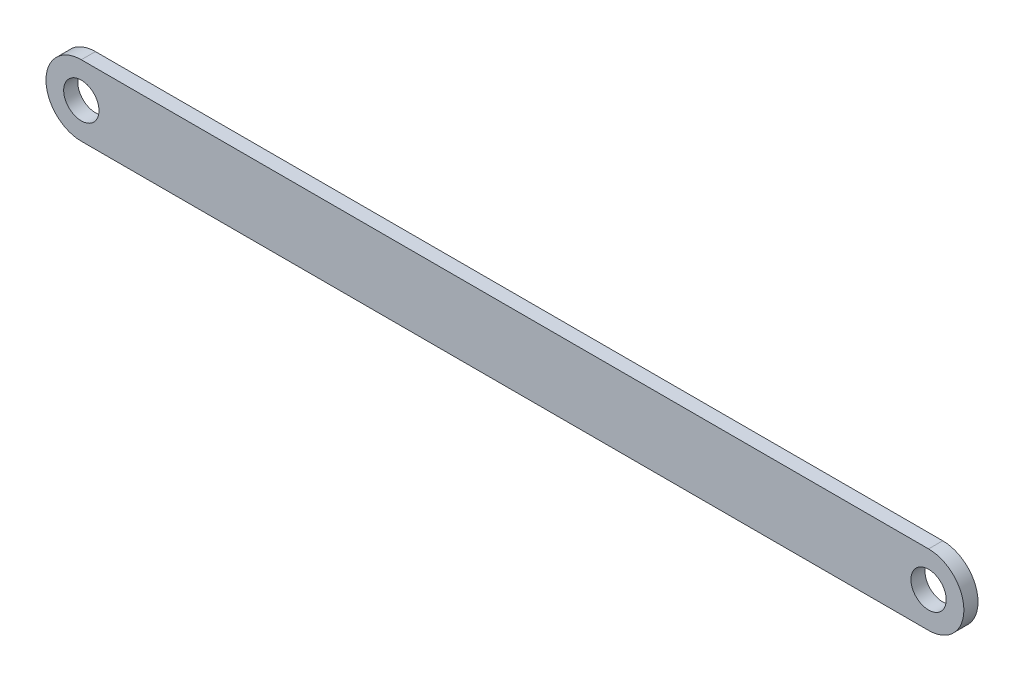
ISO-10303-21;
HEADER;
FILE_DESCRIPTION(('STEP AP214'),'2;1');
FILE_NAME('part.step','',(''),(''),'','','');
FILE_SCHEMA(('AUTOMOTIVE_DESIGN { 1 0 10303 214 1 1 1 1 }'));
ENDSEC;
DATA;
#1=APPLICATION_CONTEXT('core data for automotive mechanical design processes');
#2=APPLICATION_PROTOCOL_DEFINITION('international standard','automotive_design',2000,#1);
#3=PRODUCT_CONTEXT('',#1,'mechanical');
#4=PRODUCT('Part','Part','',(#3));
#5=PRODUCT_RELATED_PRODUCT_CATEGORY('part','',(#4));
#6=PRODUCT_DEFINITION_FORMATION('','',#4);
#7=PRODUCT_DEFINITION_CONTEXT('part definition',#1,'design');
#8=PRODUCT_DEFINITION('design','',#6,#7);
#9=PRODUCT_DEFINITION_SHAPE('','',#8);
#10=(LENGTH_UNIT() NAMED_UNIT(*) SI_UNIT(.MILLI.,.METRE.));
#11=(NAMED_UNIT(*) PLANE_ANGLE_UNIT() SI_UNIT($,.RADIAN.));
#12=(NAMED_UNIT(*) SI_UNIT($,.STERADIAN.) SOLID_ANGLE_UNIT());
#13=UNCERTAINTY_MEASURE_WITH_UNIT(LENGTH_MEASURE(1.E-05),#10,'distance_accuracy_value','');
#14=(GEOMETRIC_REPRESENTATION_CONTEXT(3) GLOBAL_UNCERTAINTY_ASSIGNED_CONTEXT((#13)) GLOBAL_UNIT_ASSIGNED_CONTEXT((#10,
#11,#12)) REPRESENTATION_CONTEXT('',''));
#15=CARTESIAN_POINT('',(0.,0.,0.));
#16=DIRECTION('',(0.,0.,1.));
#17=DIRECTION('',(1.,0.,0.));
#18=AXIS2_PLACEMENT_3D('',#15,#16,#17);
#19=CARTESIAN_POINT('',(-34.4915254237288,0.,2.));
#20=DIRECTION('',(0.,0.,1.));
#21=DIRECTION('',(1.,0.,0.));
#22=AXIS2_PLACEMENT_3D('',#19,#20,#21);
#23=PLANE('',#22);
#24=CARTESIAN_POINT('',(-34.4915254237288,0.,2.));
#25=DIRECTION('',(0.,0.,1.));
#26=DIRECTION('',(1.,0.,0.));
#27=AXIS2_PLACEMENT_3D('',#24,#25,#26);
#28=CIRCLE('',#27,2.5);
#29=CARTESIAN_POINT('',(-31.9915254237288,0.,2.));
#30=VERTEX_POINT('',#29);
#31=EDGE_CURVE('E110',#30,#30,#28,.T.);
#32=ORIENTED_EDGE('',*,*,#31,.F.);
#33=EDGE_LOOP('',(#32));
#34=FACE_BOUND('',#33,.T.);
#35=CARTESIAN_POINT('',(-34.4915254237288,0.,2.));
#36=DIRECTION('',(0.,0.,1.));
#37=DIRECTION('',(1.,0.,0.));
#38=AXIS2_PLACEMENT_3D('',#35,#36,#37);
#39=CIRCLE('',#38,5.);
#40=CARTESIAN_POINT('',(-34.4915254237288,5.,2.));
#41=VERTEX_POINT('',#40);
#42=CARTESIAN_POINT('',(-34.4915254237288,-5.,2.));
#43=VERTEX_POINT('',#42);
#44=EDGE_CURVE('E95',#41,#43,#39,.T.);
#45=ORIENTED_EDGE('',*,*,#44,.T.);
#46=DIRECTION('',(1.,0.,0.));
#47=VECTOR('',#46,1.);
#48=CARTESIAN_POINT('',(-34.4915254237288,-5.,2.));
#49=LINE('',#48,#47);
#50=CARTESIAN_POINT('',(85.5084745762712,-5.,2.));
#51=VERTEX_POINT('',#50);
#52=EDGE_CURVE('E90',#43,#51,#49,.T.);
#53=ORIENTED_EDGE('',*,*,#52,.T.);
#54=CARTESIAN_POINT('',(85.5084745762712,0.,2.));
#55=DIRECTION('',(0.,0.,1.));
#56=DIRECTION('',(1.,0.,0.));
#57=AXIS2_PLACEMENT_3D('',#54,#55,#56);
#58=CIRCLE('',#57,5.);
#59=CARTESIAN_POINT('',(85.5084745762712,5.,2.));
#60=VERTEX_POINT('',#59);
#61=EDGE_CURVE('E93',#51,#60,#58,.T.);
#62=ORIENTED_EDGE('',*,*,#61,.T.);
#63=DIRECTION('',(-1.,0.,0.));
#64=VECTOR('',#63,1.);
#65=CARTESIAN_POINT('',(-34.4915254237288,5.,2.));
#66=LINE('',#65,#64);
#67=EDGE_CURVE('E60',#60,#41,#66,.T.);
#68=ORIENTED_EDGE('',*,*,#67,.T.);
#69=EDGE_LOOP('',(#45,#53,#62,#68));
#70=FACE_BOUND('',#69,.T.);
#71=CARTESIAN_POINT('',(85.5084745762712,0.,2.));
#72=DIRECTION('',(0.,0.,1.));
#73=DIRECTION('',(1.,0.,0.));
#74=AXIS2_PLACEMENT_3D('',#71,#72,#73);
#75=CIRCLE('',#74,2.5);
#76=CARTESIAN_POINT('',(88.0084745762712,0.,2.));
#77=VERTEX_POINT('',#76);
#78=EDGE_CURVE('E125',#77,#77,#75,.T.);
#79=ORIENTED_EDGE('',*,*,#78,.F.);
#80=EDGE_LOOP('',(#79));
#81=FACE_BOUND('',#80,.T.);
#82=ADVANCED_FACE('F43',(#34,#70,#81),#23,.T.);
#83=CARTESIAN_POINT('',(-34.4915254237288,0.,0.));
#84=DIRECTION('',(0.,0.,1.));
#85=DIRECTION('',(1.,0.,0.));
#86=AXIS2_PLACEMENT_3D('',#83,#84,#85);
#87=PLANE('',#86);
#88=CARTESIAN_POINT('',(-34.4915254237288,0.,0.));
#89=DIRECTION('',(0.,0.,1.));
#90=DIRECTION('',(1.,0.,0.));
#91=AXIS2_PLACEMENT_3D('',#88,#89,#90);
#92=CIRCLE('',#91,5.);
#93=CARTESIAN_POINT('',(-34.4915254237288,5.,0.));
#94=VERTEX_POINT('',#93);
#95=CARTESIAN_POINT('',(-34.4915254237288,-5.,0.));
#96=VERTEX_POINT('',#95);
#97=EDGE_CURVE('E107',#94,#96,#92,.T.);
#98=ORIENTED_EDGE('',*,*,#97,.F.);
#99=DIRECTION('',(-1.,0.,0.));
#100=VECTOR('',#99,1.);
#101=CARTESIAN_POINT('',(-34.4915254237288,5.,0.));
#102=LINE('',#101,#100);
#103=CARTESIAN_POINT('',(85.5084745762712,5.,0.));
#104=VERTEX_POINT('',#103);
#105=EDGE_CURVE('E83',#104,#94,#102,.T.);
#106=ORIENTED_EDGE('',*,*,#105,.F.);
#107=CARTESIAN_POINT('',(85.5084745762712,0.,0.));
#108=DIRECTION('',(0.,0.,1.));
#109=DIRECTION('',(1.,0.,0.));
#110=AXIS2_PLACEMENT_3D('',#107,#108,#109);
#111=CIRCLE('',#110,5.);
#112=CARTESIAN_POINT('',(85.5084745762712,-5.,0.));
#113=VERTEX_POINT('',#112);
#114=EDGE_CURVE('E77',#113,#104,#111,.T.);
#115=ORIENTED_EDGE('',*,*,#114,.F.);
#116=DIRECTION('',(1.,0.,0.));
#117=VECTOR('',#116,1.);
#118=CARTESIAN_POINT('',(-34.4915254237288,-5.,0.));
#119=LINE('',#118,#117);
#120=EDGE_CURVE('E99',#96,#113,#119,.T.);
#121=ORIENTED_EDGE('',*,*,#120,.F.);
#122=EDGE_LOOP('',(#98,#106,#115,#121));
#123=FACE_BOUND('',#122,.T.);
#124=CARTESIAN_POINT('',(-34.4915254237288,0.,0.));
#125=DIRECTION('',(0.,0.,1.));
#126=DIRECTION('',(1.,0.,0.));
#127=AXIS2_PLACEMENT_3D('',#124,#125,#126);
#128=CIRCLE('',#127,2.5);
#129=CARTESIAN_POINT('',(-31.9915254237288,0.,0.));
#130=VERTEX_POINT('',#129);
#131=EDGE_CURVE('E122',#130,#130,#128,.T.);
#132=ORIENTED_EDGE('',*,*,#131,.T.);
#133=EDGE_LOOP('',(#132));
#134=FACE_BOUND('',#133,.T.);
#135=CARTESIAN_POINT('',(85.5084745762712,0.,0.));
#136=DIRECTION('',(0.,0.,1.));
#137=DIRECTION('',(1.,0.,0.));
#138=AXIS2_PLACEMENT_3D('',#135,#136,#137);
#139=CIRCLE('',#138,2.5);
#140=CARTESIAN_POINT('',(88.0084745762712,0.,0.));
#141=VERTEX_POINT('',#140);
#142=EDGE_CURVE('E128',#141,#141,#139,.T.);
#143=ORIENTED_EDGE('',*,*,#142,.T.);
#144=EDGE_LOOP('',(#143));
#145=FACE_BOUND('',#144,.T.);
#146=ADVANCED_FACE('F118',(#123,#134,#145),#87,.F.);
#147=CARTESIAN_POINT('',(-34.4915254237288,0.,2.));
#148=DIRECTION('',(0.,0.,-1.));
#149=DIRECTION('',(-1.,0.,0.));
#150=AXIS2_PLACEMENT_3D('',#147,#148,#149);
#151=CYLINDRICAL_SURFACE('',#150,5.);
#152=ORIENTED_EDGE('',*,*,#97,.T.);
#153=DIRECTION('',(0.,0.,-1.));
#154=VECTOR('',#153,1.);
#155=CARTESIAN_POINT('',(-34.4915254237288,-5.,2.));
#156=LINE('',#155,#154);
#157=EDGE_CURVE('E11',#43,#96,#156,.T.);
#158=ORIENTED_EDGE('',*,*,#157,.F.);
#159=ORIENTED_EDGE('',*,*,#44,.F.);
#160=DIRECTION('',(0.,0.,-1.));
#161=VECTOR('',#160,1.);
#162=CARTESIAN_POINT('',(-34.4915254237288,5.,2.));
#163=LINE('',#162,#161);
#164=EDGE_CURVE('E103',#41,#94,#163,.T.);
#165=ORIENTED_EDGE('',*,*,#164,.T.);
#166=EDGE_LOOP('',(#152,#158,#159,#165));
#167=FACE_BOUND('',#166,.T.);
#168=ADVANCED_FACE('F45',(#167),#151,.T.);
#169=CARTESIAN_POINT('',(-34.4915254237288,-5.,2.));
#170=DIRECTION('',(0.,1.,0.));
#171=DIRECTION('',(0.,0.,1.));
#172=AXIS2_PLACEMENT_3D('',#169,#170,#171);
#173=PLANE('',#172);
#174=ORIENTED_EDGE('',*,*,#120,.T.);
#175=DIRECTION('',(0.,0.,-1.));
#176=VECTOR('',#175,1.);
#177=CARTESIAN_POINT('',(85.5084745762712,-5.,2.));
#178=LINE('',#177,#176);
#179=EDGE_CURVE('E52',#51,#113,#178,.T.);
#180=ORIENTED_EDGE('',*,*,#179,.F.);
#181=ORIENTED_EDGE('',*,*,#52,.F.);
#182=ORIENTED_EDGE('',*,*,#157,.T.);
#183=EDGE_LOOP('',(#174,#180,#181,#182));
#184=FACE_BOUND('',#183,.T.);
#185=ADVANCED_FACE('F98',(#184),#173,.F.);
#186=CARTESIAN_POINT('',(85.5084745762712,0.,2.));
#187=DIRECTION('',(0.,0.,-1.));
#188=DIRECTION('',(-1.,0.,0.));
#189=AXIS2_PLACEMENT_3D('',#186,#187,#188);
#190=CYLINDRICAL_SURFACE('',#189,5.);
#191=ORIENTED_EDGE('',*,*,#114,.T.);
#192=DIRECTION('',(0.,0.,-1.));
#193=VECTOR('',#192,1.);
#194=CARTESIAN_POINT('',(85.5084745762712,5.,2.));
#195=LINE('',#194,#193);
#196=EDGE_CURVE('E100',#60,#104,#195,.T.);
#197=ORIENTED_EDGE('',*,*,#196,.F.);
#198=ORIENTED_EDGE('',*,*,#61,.F.);
#199=ORIENTED_EDGE('',*,*,#179,.T.);
#200=EDGE_LOOP('',(#191,#197,#198,#199));
#201=FACE_BOUND('',#200,.T.);
#202=ADVANCED_FACE('F101',(#201),#190,.T.);
#203=CARTESIAN_POINT('',(-34.4915254237288,5.,2.));
#204=DIRECTION('',(0.,-1.,0.));
#205=DIRECTION('',(0.,0.,-1.));
#206=AXIS2_PLACEMENT_3D('',#203,#204,#205);
#207=PLANE('',#206);
#208=ORIENTED_EDGE('',*,*,#105,.T.);
#209=ORIENTED_EDGE('',*,*,#164,.F.);
#210=ORIENTED_EDGE('',*,*,#67,.F.);
#211=ORIENTED_EDGE('',*,*,#196,.T.);
#212=EDGE_LOOP('',(#208,#209,#210,#211));
#213=FACE_BOUND('',#212,.T.);
#214=ADVANCED_FACE('F115',(#213),#207,.F.);
#215=CARTESIAN_POINT('',(-34.4915254237288,0.,2.));
#216=DIRECTION('',(0.,0.,-1.));
#217=DIRECTION('',(-1.,0.,0.));
#218=AXIS2_PLACEMENT_3D('',#215,#216,#217);
#219=CYLINDRICAL_SURFACE('',#218,2.5);
#220=ORIENTED_EDGE('',*,*,#31,.T.);
#221=EDGE_LOOP('',(#220));
#222=FACE_BOUND('',#221,.T.);
#223=ORIENTED_EDGE('',*,*,#131,.F.);
#224=EDGE_LOOP('',(#223));
#225=FACE_BOUND('',#224,.T.);
#226=ADVANCED_FACE('F145',(#222,#225),#219,.F.);
#227=CARTESIAN_POINT('',(85.5084745762712,0.,2.));
#228=DIRECTION('',(0.,0.,-1.));
#229=DIRECTION('',(-1.,0.,0.));
#230=AXIS2_PLACEMENT_3D('',#227,#228,#229);
#231=CYLINDRICAL_SURFACE('',#230,2.5);
#232=ORIENTED_EDGE('',*,*,#78,.T.);
#233=EDGE_LOOP('',(#232));
#234=FACE_BOUND('',#233,.T.);
#235=ORIENTED_EDGE('',*,*,#142,.F.);
#236=EDGE_LOOP('',(#235));
#237=FACE_BOUND('',#236,.T.);
#238=ADVANCED_FACE('F134',(#234,#237),#231,.F.);
#239=CLOSED_SHELL('',(#82,#146,#168,#185,#202,#214,#226,#238));
#240=MANIFOLD_SOLID_BREP('B2',#239);
#241=ADVANCED_BREP_SHAPE_REPRESENTATION('',(#18,#240),#14);
#242=SHAPE_DEFINITION_REPRESENTATION(#9,#241);
ENDSEC;
END-ISO-10303-21;
